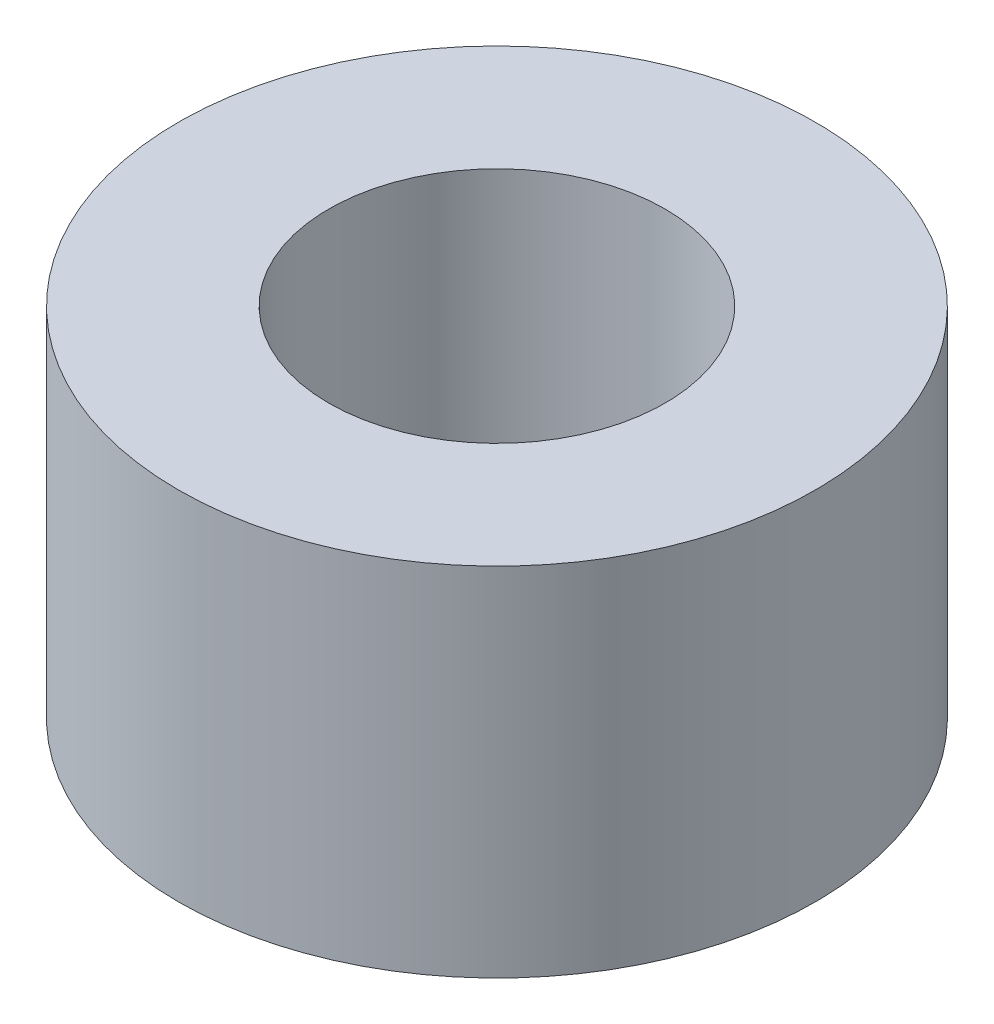
ISO-10303-21;
HEADER;
FILE_DESCRIPTION(('STEP AP214'),'2;1');
FILE_NAME('part.step','',(''),(''),'','','');
FILE_SCHEMA(('AUTOMOTIVE_DESIGN { 1 0 10303 214 1 1 1 1 }'));
ENDSEC;
DATA;
#1=APPLICATION_CONTEXT('core data for automotive mechanical design processes');
#2=APPLICATION_PROTOCOL_DEFINITION('international standard','automotive_design',2000,#1);
#3=PRODUCT_CONTEXT('',#1,'mechanical');
#4=PRODUCT('Part','Part','',(#3));
#5=PRODUCT_RELATED_PRODUCT_CATEGORY('part','',(#4));
#6=PRODUCT_DEFINITION_FORMATION('','',#4);
#7=PRODUCT_DEFINITION_CONTEXT('part definition',#1,'design');
#8=PRODUCT_DEFINITION('design','',#6,#7);
#9=PRODUCT_DEFINITION_SHAPE('','',#8);
#10=(LENGTH_UNIT() NAMED_UNIT(*) SI_UNIT(.MILLI.,.METRE.));
#11=(NAMED_UNIT(*) PLANE_ANGLE_UNIT() SI_UNIT($,.RADIAN.));
#12=(NAMED_UNIT(*) SI_UNIT($,.STERADIAN.) SOLID_ANGLE_UNIT());
#13=UNCERTAINTY_MEASURE_WITH_UNIT(LENGTH_MEASURE(1.E-05),#10,'distance_accuracy_value','');
#14=(GEOMETRIC_REPRESENTATION_CONTEXT(3) GLOBAL_UNCERTAINTY_ASSIGNED_CONTEXT((#13)) GLOBAL_UNIT_ASSIGNED_CONTEXT((#10,
#11,#12)) REPRESENTATION_CONTEXT('',''));
#15=CARTESIAN_POINT('',(0.,0.,0.));
#16=DIRECTION('',(0.,0.,1.));
#17=DIRECTION('',(1.,0.,0.));
#18=AXIS2_PLACEMENT_3D('',#15,#16,#17);
#19=CARTESIAN_POINT('',(0.,7.,0.));
#20=DIRECTION('',(0.,1.,0.));
#21=DIRECTION('',(0.,0.,1.));
#22=AXIS2_PLACEMENT_3D('',#19,#20,#21);
#23=PLANE('',#22);
#24=CARTESIAN_POINT('',(0.,7.,0.));
#25=DIRECTION('',(0.,1.,0.));
#26=DIRECTION('',(0.,0.,1.));
#27=AXIS2_PLACEMENT_3D('',#24,#25,#26);
#28=CIRCLE('',#27,6.25000000000001);
#29=CARTESIAN_POINT('',(0.,7.,6.25000000000001));
#30=VERTEX_POINT('',#29);
#31=EDGE_CURVE('E10',#30,#30,#28,.T.);
#32=ORIENTED_EDGE('',*,*,#31,.T.);
#33=EDGE_LOOP('',(#32));
#34=FACE_BOUND('',#33,.T.);
#35=CARTESIAN_POINT('',(0.,7.,0.));
#36=DIRECTION('',(0.,1.,0.));
#37=DIRECTION('',(0.,0.,1.));
#38=AXIS2_PLACEMENT_3D('',#35,#36,#37);
#39=CIRCLE('',#38,3.3);
#40=CARTESIAN_POINT('',(0.,7.,3.3));
#41=VERTEX_POINT('',#40);
#42=EDGE_CURVE('E42',#41,#41,#39,.T.);
#43=ORIENTED_EDGE('',*,*,#42,.F.);
#44=EDGE_LOOP('',(#43));
#45=FACE_BOUND('',#44,.T.);
#46=ADVANCED_FACE('F31',(#34,#45),#23,.T.);
#47=CARTESIAN_POINT('',(0.,0.,0.));
#48=DIRECTION('',(0.,1.,0.));
#49=DIRECTION('',(0.,0.,1.));
#50=AXIS2_PLACEMENT_3D('',#47,#48,#49);
#51=PLANE('',#50);
#52=CARTESIAN_POINT('',(0.,0.,0.));
#53=DIRECTION('',(0.,1.,0.));
#54=DIRECTION('',(0.,0.,1.));
#55=AXIS2_PLACEMENT_3D('',#52,#53,#54);
#56=CIRCLE('',#55,6.25000000000001);
#57=CARTESIAN_POINT('',(0.,0.,6.25000000000001));
#58=VERTEX_POINT('',#57);
#59=EDGE_CURVE('E35',#58,#58,#56,.T.);
#60=ORIENTED_EDGE('',*,*,#59,.F.);
#61=EDGE_LOOP('',(#60));
#62=FACE_BOUND('',#61,.T.);
#63=CARTESIAN_POINT('',(0.,0.,0.));
#64=DIRECTION('',(0.,1.,0.));
#65=DIRECTION('',(0.,0.,1.));
#66=AXIS2_PLACEMENT_3D('',#63,#64,#65);
#67=CIRCLE('',#66,3.3);
#68=CARTESIAN_POINT('',(0.,0.,3.3));
#69=VERTEX_POINT('',#68);
#70=EDGE_CURVE('E44',#69,#69,#67,.T.);
#71=ORIENTED_EDGE('',*,*,#70,.T.);
#72=EDGE_LOOP('',(#71));
#73=FACE_BOUND('',#72,.T.);
#74=ADVANCED_FACE('F54',(#62,#73),#51,.F.);
#75=CARTESIAN_POINT('',(0.,7.,0.));
#76=DIRECTION('',(0.,-1.,0.));
#77=DIRECTION('',(0.,0.,-1.));
#78=AXIS2_PLACEMENT_3D('',#75,#76,#77);
#79=CYLINDRICAL_SURFACE('',#78,6.25000000000001);
#80=ORIENTED_EDGE('',*,*,#31,.F.);
#81=EDGE_LOOP('',(#80));
#82=FACE_BOUND('',#81,.T.);
#83=ORIENTED_EDGE('',*,*,#59,.T.);
#84=EDGE_LOOP('',(#83));
#85=FACE_BOUND('',#84,.T.);
#86=ADVANCED_FACE('F33',(#82,#85),#79,.T.);
#87=CARTESIAN_POINT('',(0.,7.,0.));
#88=DIRECTION('',(0.,-1.,0.));
#89=DIRECTION('',(0.,0.,-1.));
#90=AXIS2_PLACEMENT_3D('',#87,#88,#89);
#91=CYLINDRICAL_SURFACE('',#90,3.3);
#92=ORIENTED_EDGE('',*,*,#42,.T.);
#93=EDGE_LOOP('',(#92));
#94=FACE_BOUND('',#93,.T.);
#95=ORIENTED_EDGE('',*,*,#70,.F.);
#96=EDGE_LOOP('',(#95));
#97=FACE_BOUND('',#96,.T.);
#98=ADVANCED_FACE('F50',(#94,#97),#91,.F.);
#99=CLOSED_SHELL('',(#46,#74,#86,#98));
#100=MANIFOLD_SOLID_BREP('B2',#99);
#101=ADVANCED_BREP_SHAPE_REPRESENTATION('',(#18,#100),#14);
#102=SHAPE_DEFINITION_REPRESENTATION(#9,#101);
ENDSEC;
END-ISO-10303-21;
